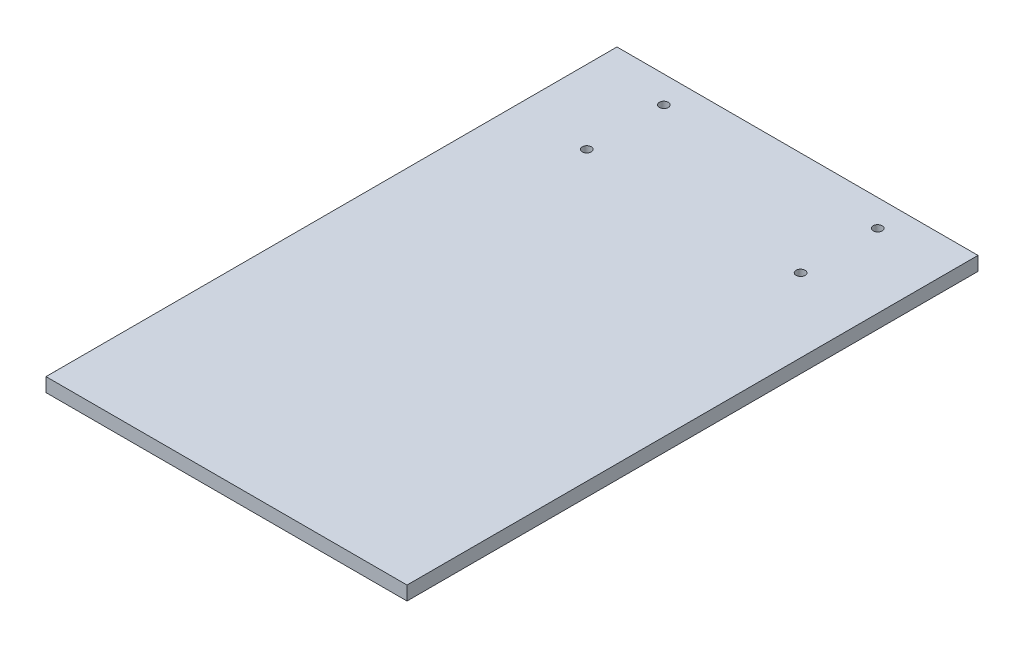
ISO-10303-21;
HEADER;
FILE_DESCRIPTION(('STEP AP214'),'2;1');
FILE_NAME('part.step','',(''),(''),'','','');
FILE_SCHEMA(('AUTOMOTIVE_DESIGN { 1 0 10303 214 1 1 1 1 }'));
ENDSEC;
DATA;
#1=APPLICATION_CONTEXT('core data for automotive mechanical design processes');
#2=APPLICATION_PROTOCOL_DEFINITION('international standard','automotive_design',2000,#1);
#3=PRODUCT_CONTEXT('',#1,'mechanical');
#4=PRODUCT('Part','Part','',(#3));
#5=PRODUCT_RELATED_PRODUCT_CATEGORY('part','',(#4));
#6=PRODUCT_DEFINITION_FORMATION('','',#4);
#7=PRODUCT_DEFINITION_CONTEXT('part definition',#1,'design');
#8=PRODUCT_DEFINITION('design','',#6,#7);
#9=PRODUCT_DEFINITION_SHAPE('','',#8);
#10=(LENGTH_UNIT() NAMED_UNIT(*) SI_UNIT(.MILLI.,.METRE.));
#11=(NAMED_UNIT(*) PLANE_ANGLE_UNIT() SI_UNIT($,.RADIAN.));
#12=(NAMED_UNIT(*) SI_UNIT($,.STERADIAN.) SOLID_ANGLE_UNIT());
#13=UNCERTAINTY_MEASURE_WITH_UNIT(LENGTH_MEASURE(1.E-05),#10,'distance_accuracy_value','');
#14=(GEOMETRIC_REPRESENTATION_CONTEXT(3) GLOBAL_UNCERTAINTY_ASSIGNED_CONTEXT((#13)) GLOBAL_UNIT_ASSIGNED_CONTEXT((#10,
#11,#12)) REPRESENTATION_CONTEXT('',''));
#15=CARTESIAN_POINT('',(0.,0.,0.));
#16=DIRECTION('',(0.,0.,1.));
#17=DIRECTION('',(1.,0.,0.));
#18=AXIS2_PLACEMENT_3D('',#15,#16,#17);
#19=CARTESIAN_POINT('',(130.,5.,-205.6));
#20=DIRECTION('',(-1.,0.,0.));
#21=DIRECTION('',(0.,0.,1.));
#22=AXIS2_PLACEMENT_3D('',#19,#20,#21);
#23=PLANE('',#22);
#24=DIRECTION('',(0.,0.,-1.));
#25=VECTOR('',#24,1.);
#26=CARTESIAN_POINT('',(130.,-5.,-205.6));
#27=LINE('',#26,#25);
#28=CARTESIAN_POINT('',(130.,-5.,205.6));
#29=VERTEX_POINT('',#28);
#30=CARTESIAN_POINT('',(130.,-5.,-205.6));
#31=VERTEX_POINT('',#30);
#32=EDGE_CURVE('E96',#29,#31,#27,.T.);
#33=ORIENTED_EDGE('',*,*,#32,.T.);
#34=DIRECTION('',(0.,-1.,0.));
#35=VECTOR('',#34,1.);
#36=CARTESIAN_POINT('',(130.,5.,-205.6));
#37=LINE('',#36,#35);
#38=CARTESIAN_POINT('',(130.,5.,-205.6));
#39=VERTEX_POINT('',#38);
#40=EDGE_CURVE('E11',#39,#31,#37,.T.);
#41=ORIENTED_EDGE('',*,*,#40,.F.);
#42=DIRECTION('',(0.,0.,-1.));
#43=VECTOR('',#42,1.);
#44=CARTESIAN_POINT('',(130.,5.,-205.6));
#45=LINE('',#44,#43);
#46=CARTESIAN_POINT('',(130.,5.,205.6));
#47=VERTEX_POINT('',#46);
#48=EDGE_CURVE('E84',#47,#39,#45,.T.);
#49=ORIENTED_EDGE('',*,*,#48,.F.);
#50=DIRECTION('',(0.,-1.,0.));
#51=VECTOR('',#50,1.);
#52=CARTESIAN_POINT('',(130.,5.,205.6));
#53=LINE('',#52,#51);
#54=EDGE_CURVE('E92',#47,#29,#53,.T.);
#55=ORIENTED_EDGE('',*,*,#54,.T.);
#56=EDGE_LOOP('',(#33,#41,#49,#55));
#57=FACE_BOUND('',#56,.T.);
#58=ADVANCED_FACE('F33',(#57),#23,.F.);
#59=CARTESIAN_POINT('',(-130.,5.,-205.6));
#60=DIRECTION('',(0.,0.,1.));
#61=DIRECTION('',(1.,0.,0.));
#62=AXIS2_PLACEMENT_3D('',#59,#60,#61);
#63=PLANE('',#62);
#64=DIRECTION('',(-1.,0.,0.));
#65=VECTOR('',#64,1.);
#66=CARTESIAN_POINT('',(-130.,-5.,-205.6));
#67=LINE('',#66,#65);
#68=CARTESIAN_POINT('',(-130.,-5.,-205.6));
#69=VERTEX_POINT('',#68);
#70=EDGE_CURVE('E88',#31,#69,#67,.T.);
#71=ORIENTED_EDGE('',*,*,#70,.T.);
#72=DIRECTION('',(0.,-1.,0.));
#73=VECTOR('',#72,1.);
#74=CARTESIAN_POINT('',(-130.,5.,-205.6));
#75=LINE('',#74,#73);
#76=CARTESIAN_POINT('',(-130.,5.,-205.6));
#77=VERTEX_POINT('',#76);
#78=EDGE_CURVE('E41',#77,#69,#75,.T.);
#79=ORIENTED_EDGE('',*,*,#78,.F.);
#80=DIRECTION('',(-1.,0.,0.));
#81=VECTOR('',#80,1.);
#82=CARTESIAN_POINT('',(-130.,5.,-205.6));
#83=LINE('',#82,#81);
#84=EDGE_CURVE('E79',#39,#77,#83,.T.);
#85=ORIENTED_EDGE('',*,*,#84,.F.);
#86=ORIENTED_EDGE('',*,*,#40,.T.);
#87=EDGE_LOOP('',(#71,#79,#85,#86));
#88=FACE_BOUND('',#87,.T.);
#89=ADVANCED_FACE('F87',(#88),#63,.F.);
#90=CARTESIAN_POINT('',(-130.,5.,-205.6));
#91=DIRECTION('',(1.,0.,0.));
#92=DIRECTION('',(0.,0.,-1.));
#93=AXIS2_PLACEMENT_3D('',#90,#91,#92);
#94=PLANE('',#93);
#95=DIRECTION('',(0.,0.,1.));
#96=VECTOR('',#95,1.);
#97=CARTESIAN_POINT('',(-130.,-5.,-205.6));
#98=LINE('',#97,#96);
#99=CARTESIAN_POINT('',(-130.,-5.,205.6));
#100=VERTEX_POINT('',#99);
#101=EDGE_CURVE('E66',#69,#100,#98,.T.);
#102=ORIENTED_EDGE('',*,*,#101,.T.);
#103=DIRECTION('',(0.,-1.,0.));
#104=VECTOR('',#103,1.);
#105=CARTESIAN_POINT('',(-130.,5.,205.6));
#106=LINE('',#105,#104);
#107=CARTESIAN_POINT('',(-130.,5.,205.6));
#108=VERTEX_POINT('',#107);
#109=EDGE_CURVE('E89',#108,#100,#106,.T.);
#110=ORIENTED_EDGE('',*,*,#109,.F.);
#111=DIRECTION('',(0.,0.,1.));
#112=VECTOR('',#111,1.);
#113=CARTESIAN_POINT('',(-130.,5.,-205.6));
#114=LINE('',#113,#112);
#115=EDGE_CURVE('E82',#77,#108,#114,.T.);
#116=ORIENTED_EDGE('',*,*,#115,.F.);
#117=ORIENTED_EDGE('',*,*,#78,.T.);
#118=EDGE_LOOP('',(#102,#110,#116,#117));
#119=FACE_BOUND('',#118,.T.);
#120=ADVANCED_FACE('F90',(#119),#94,.F.);
#121=CARTESIAN_POINT('',(-130.,5.,205.6));
#122=DIRECTION('',(0.,0.,-1.));
#123=DIRECTION('',(-1.,0.,0.));
#124=AXIS2_PLACEMENT_3D('',#121,#122,#123);
#125=PLANE('',#124);
#126=DIRECTION('',(1.,0.,0.));
#127=VECTOR('',#126,1.);
#128=CARTESIAN_POINT('',(-130.,-5.,205.6));
#129=LINE('',#128,#127);
#130=EDGE_CURVE('E72',#100,#29,#129,.T.);
#131=ORIENTED_EDGE('',*,*,#130,.T.);
#132=ORIENTED_EDGE('',*,*,#54,.F.);
#133=DIRECTION('',(1.,0.,0.));
#134=VECTOR('',#133,1.);
#135=CARTESIAN_POINT('',(-130.,5.,205.6));
#136=LINE('',#135,#134);
#137=EDGE_CURVE('E49',#108,#47,#136,.T.);
#138=ORIENTED_EDGE('',*,*,#137,.F.);
#139=ORIENTED_EDGE('',*,*,#109,.T.);
#140=EDGE_LOOP('',(#131,#132,#138,#139));
#141=FACE_BOUND('',#140,.T.);
#142=ADVANCED_FACE('F104',(#141),#125,.F.);
#143=CARTESIAN_POINT('',(0.,5.,0.));
#144=DIRECTION('',(0.,1.,0.));
#145=DIRECTION('',(0.,0.,1.));
#146=AXIS2_PLACEMENT_3D('',#143,#144,#145);
#147=PLANE('',#146);
#148=CARTESIAN_POINT('',(-77.0000000000001,5.,-130.85));
#149=DIRECTION('',(0.,1.,0.));
#150=DIRECTION('',(0.,0.,-1.));
#151=AXIS2_PLACEMENT_3D('',#148,#149,#150);
#152=CIRCLE('',#151,3.24999999999999);
#153=CARTESIAN_POINT('',(-77.0000000000001,5.,-134.1));
#154=VERTEX_POINT('',#153);
#155=EDGE_CURVE('E116',#154,#154,#152,.T.);
#156=ORIENTED_EDGE('',*,*,#155,.F.);
#157=EDGE_LOOP('',(#156));
#158=FACE_BOUND('',#157,.T.);
#159=CARTESIAN_POINT('',(77.0000000000001,5.,-130.85));
#160=DIRECTION('',(0.,1.,0.));
#161=DIRECTION('',(0.,0.,1.));
#162=AXIS2_PLACEMENT_3D('',#159,#160,#161);
#163=CIRCLE('',#162,3.24999999999999);
#164=CARTESIAN_POINT('',(77.0000000000001,5.,-127.6));
#165=VERTEX_POINT('',#164);
#166=EDGE_CURVE('E122',#165,#165,#163,.T.);
#167=ORIENTED_EDGE('',*,*,#166,.F.);
#168=EDGE_LOOP('',(#167));
#169=FACE_BOUND('',#168,.T.);
#170=CARTESIAN_POINT('',(77.0000000000001,5.,-186.35));
#171=DIRECTION('',(0.,1.,0.));
#172=DIRECTION('',(0.,0.,-1.));
#173=AXIS2_PLACEMENT_3D('',#170,#171,#172);
#174=CIRCLE('',#173,3.24999999999999);
#175=CARTESIAN_POINT('',(77.0000000000001,5.,-189.6));
#176=VERTEX_POINT('',#175);
#177=EDGE_CURVE('E128',#176,#176,#174,.T.);
#178=ORIENTED_EDGE('',*,*,#177,.F.);
#179=EDGE_LOOP('',(#178));
#180=FACE_BOUND('',#179,.T.);
#181=CARTESIAN_POINT('',(-77.0000000000001,5.,-186.35));
#182=DIRECTION('',(0.,1.,0.));
#183=DIRECTION('',(0.,0.,1.));
#184=AXIS2_PLACEMENT_3D('',#181,#182,#183);
#185=CIRCLE('',#184,3.24999999999999);
#186=CARTESIAN_POINT('',(-77.0000000000001,5.,-183.1));
#187=VERTEX_POINT('',#186);
#188=EDGE_CURVE('E110',#187,#187,#185,.T.);
#189=ORIENTED_EDGE('',*,*,#188,.F.);
#190=EDGE_LOOP('',(#189));
#191=FACE_BOUND('',#190,.T.);
#192=ORIENTED_EDGE('',*,*,#48,.T.);
#193=ORIENTED_EDGE('',*,*,#84,.T.);
#194=ORIENTED_EDGE('',*,*,#115,.T.);
#195=ORIENTED_EDGE('',*,*,#137,.T.);
#196=EDGE_LOOP('',(#192,#193,#194,#195));
#197=FACE_BOUND('',#196,.T.);
#198=ADVANCED_FACE('F80',(#158,#169,#180,#191,#197),#147,.T.);
#199=CARTESIAN_POINT('',(0.,-5.,0.));
#200=DIRECTION('',(0.,1.,0.));
#201=DIRECTION('',(0.,0.,1.));
#202=AXIS2_PLACEMENT_3D('',#199,#200,#201);
#203=PLANE('',#202);
#204=CARTESIAN_POINT('',(-77.0000000000001,-5.,-130.85));
#205=DIRECTION('',(0.,1.,0.));
#206=DIRECTION('',(0.,0.,-1.));
#207=AXIS2_PLACEMENT_3D('',#204,#205,#206);
#208=CIRCLE('',#207,3.24999999999999);
#209=CARTESIAN_POINT('',(-77.0000000000001,-5.,-134.1));
#210=VERTEX_POINT('',#209);
#211=EDGE_CURVE('E119',#210,#210,#208,.T.);
#212=ORIENTED_EDGE('',*,*,#211,.T.);
#213=EDGE_LOOP('',(#212));
#214=FACE_BOUND('',#213,.T.);
#215=CARTESIAN_POINT('',(77.0000000000001,-5.,-130.85));
#216=DIRECTION('',(0.,1.,0.));
#217=DIRECTION('',(0.,0.,1.));
#218=AXIS2_PLACEMENT_3D('',#215,#216,#217);
#219=CIRCLE('',#218,3.24999999999999);
#220=CARTESIAN_POINT('',(77.0000000000001,-5.,-127.6));
#221=VERTEX_POINT('',#220);
#222=EDGE_CURVE('E125',#221,#221,#219,.T.);
#223=ORIENTED_EDGE('',*,*,#222,.T.);
#224=EDGE_LOOP('',(#223));
#225=FACE_BOUND('',#224,.T.);
#226=CARTESIAN_POINT('',(77.0000000000001,-5.,-186.35));
#227=DIRECTION('',(0.,1.,0.));
#228=DIRECTION('',(0.,0.,-1.));
#229=AXIS2_PLACEMENT_3D('',#226,#227,#228);
#230=CIRCLE('',#229,3.24999999999999);
#231=CARTESIAN_POINT('',(77.0000000000001,-5.,-189.6));
#232=VERTEX_POINT('',#231);
#233=EDGE_CURVE('E113',#232,#232,#230,.T.);
#234=ORIENTED_EDGE('',*,*,#233,.T.);
#235=EDGE_LOOP('',(#234));
#236=FACE_BOUND('',#235,.T.);
#237=CARTESIAN_POINT('',(-77.0000000000001,-5.,-186.35));
#238=DIRECTION('',(0.,1.,0.));
#239=DIRECTION('',(0.,0.,1.));
#240=AXIS2_PLACEMENT_3D('',#237,#238,#239);
#241=CIRCLE('',#240,3.24999999999999);
#242=CARTESIAN_POINT('',(-77.0000000000001,-5.,-183.1));
#243=VERTEX_POINT('',#242);
#244=EDGE_CURVE('E99',#243,#243,#241,.T.);
#245=ORIENTED_EDGE('',*,*,#244,.T.);
#246=EDGE_LOOP('',(#245));
#247=FACE_BOUND('',#246,.T.);
#248=ORIENTED_EDGE('',*,*,#32,.F.);
#249=ORIENTED_EDGE('',*,*,#130,.F.);
#250=ORIENTED_EDGE('',*,*,#101,.F.);
#251=ORIENTED_EDGE('',*,*,#70,.F.);
#252=EDGE_LOOP('',(#248,#249,#250,#251));
#253=FACE_BOUND('',#252,.T.);
#254=ADVANCED_FACE('F107',(#214,#225,#236,#247,#253),#203,.F.);
#255=CARTESIAN_POINT('',(-77.0000000000001,-5.,-186.35));
#256=DIRECTION('',(0.,1.,0.));
#257=DIRECTION('',(0.,0.,1.));
#258=AXIS2_PLACEMENT_3D('',#255,#256,#257);
#259=CYLINDRICAL_SURFACE('',#258,3.24999999999999);
#260=ORIENTED_EDGE('',*,*,#244,.F.);
#261=EDGE_LOOP('',(#260));
#262=FACE_BOUND('',#261,.T.);
#263=ORIENTED_EDGE('',*,*,#188,.T.);
#264=EDGE_LOOP('',(#263));
#265=FACE_BOUND('',#264,.T.);
#266=ADVANCED_FACE('F140',(#262,#265),#259,.F.);
#267=CARTESIAN_POINT('',(77.0000000000001,-5.,-186.35));
#268=DIRECTION('',(0.,1.,0.));
#269=DIRECTION('',(0.,0.,1.));
#270=AXIS2_PLACEMENT_3D('',#267,#268,#269);
#271=CYLINDRICAL_SURFACE('',#270,3.24999999999999);
#272=ORIENTED_EDGE('',*,*,#233,.F.);
#273=EDGE_LOOP('',(#272));
#274=FACE_BOUND('',#273,.T.);
#275=ORIENTED_EDGE('',*,*,#177,.T.);
#276=EDGE_LOOP('',(#275));
#277=FACE_BOUND('',#276,.T.);
#278=ADVANCED_FACE('F136',(#274,#277),#271,.F.);
#279=CARTESIAN_POINT('',(77.0000000000001,-5.,-130.85));
#280=DIRECTION('',(0.,1.,0.));
#281=DIRECTION('',(0.,0.,1.));
#282=AXIS2_PLACEMENT_3D('',#279,#280,#281);
#283=CYLINDRICAL_SURFACE('',#282,3.24999999999999);
#284=ORIENTED_EDGE('',*,*,#222,.F.);
#285=EDGE_LOOP('',(#284));
#286=FACE_BOUND('',#285,.T.);
#287=ORIENTED_EDGE('',*,*,#166,.T.);
#288=EDGE_LOOP('',(#287));
#289=FACE_BOUND('',#288,.T.);
#290=ADVANCED_FACE('F139',(#286,#289),#283,.F.);
#291=CARTESIAN_POINT('',(-77.0000000000001,-5.,-130.85));
#292=DIRECTION('',(0.,1.,0.));
#293=DIRECTION('',(0.,0.,1.));
#294=AXIS2_PLACEMENT_3D('',#291,#292,#293);
#295=CYLINDRICAL_SURFACE('',#294,3.24999999999999);
#296=ORIENTED_EDGE('',*,*,#211,.F.);
#297=EDGE_LOOP('',(#296));
#298=FACE_BOUND('',#297,.T.);
#299=ORIENTED_EDGE('',*,*,#155,.T.);
#300=EDGE_LOOP('',(#299));
#301=FACE_BOUND('',#300,.T.);
#302=ADVANCED_FACE('F201',(#298,#301),#295,.F.);
#303=CLOSED_SHELL('',(#58,#89,#120,#142,#198,#254,#266,#278,#290,#302));
#304=MANIFOLD_SOLID_BREP('B2',#303);
#305=ADVANCED_BREP_SHAPE_REPRESENTATION('',(#18,#304),#14);
#306=SHAPE_DEFINITION_REPRESENTATION(#9,#305);
ENDSEC;
END-ISO-10303-21;
